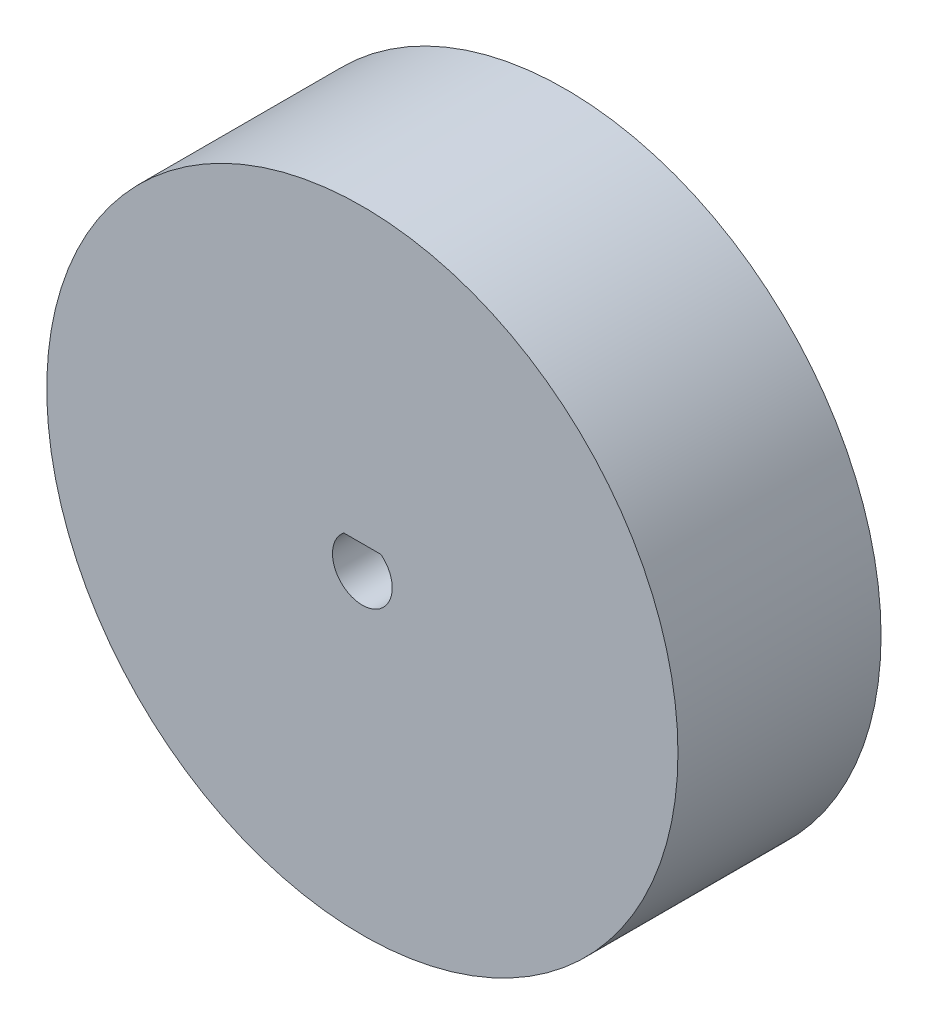
ISO-10303-21;
HEADER;
FILE_DESCRIPTION(('STEP AP214'),'2;1');
FILE_NAME('part.step','',(''),(''),'','','');
FILE_SCHEMA(('AUTOMOTIVE_DESIGN { 1 0 10303 214 1 1 1 1 }'));
ENDSEC;
DATA;
#1=APPLICATION_CONTEXT('core data for automotive mechanical design processes');
#2=APPLICATION_PROTOCOL_DEFINITION('international standard','automotive_design',2000,#1);
#3=PRODUCT_CONTEXT('',#1,'mechanical');
#4=PRODUCT('Part','Part','',(#3));
#5=PRODUCT_RELATED_PRODUCT_CATEGORY('part','',(#4));
#6=PRODUCT_DEFINITION_FORMATION('','',#4);
#7=PRODUCT_DEFINITION_CONTEXT('part definition',#1,'design');
#8=PRODUCT_DEFINITION('design','',#6,#7);
#9=PRODUCT_DEFINITION_SHAPE('','',#8);
#10=(LENGTH_UNIT() NAMED_UNIT(*) SI_UNIT(.MILLI.,.METRE.));
#11=(NAMED_UNIT(*) PLANE_ANGLE_UNIT() SI_UNIT($,.RADIAN.));
#12=(NAMED_UNIT(*) SI_UNIT($,.STERADIAN.) SOLID_ANGLE_UNIT());
#13=UNCERTAINTY_MEASURE_WITH_UNIT(LENGTH_MEASURE(1.E-05),#10,'distance_accuracy_value','');
#14=(GEOMETRIC_REPRESENTATION_CONTEXT(3) GLOBAL_UNCERTAINTY_ASSIGNED_CONTEXT((#13)) GLOBAL_UNIT_ASSIGNED_CONTEXT((#10,
#11,#12)) REPRESENTATION_CONTEXT('',''));
#15=CARTESIAN_POINT('',(0.,0.,0.));
#16=DIRECTION('',(0.,0.,1.));
#17=DIRECTION('',(1.,0.,0.));
#18=AXIS2_PLACEMENT_3D('',#15,#16,#17);
#19=CARTESIAN_POINT('',(0.,0.,13.899999886));
#20=DIRECTION('',(0.,0.,1.));
#21=DIRECTION('',(1.,0.,0.));
#22=AXIS2_PLACEMENT_3D('',#19,#20,#21);
#23=PLANE('',#22);
#24=CARTESIAN_POINT('',(0.,0.,13.899999886));
#25=DIRECTION('',(0.,0.,1.));
#26=DIRECTION('',(1.,0.,0.));
#27=AXIS2_PLACEMENT_3D('',#24,#25,#26);
#28=CIRCLE('',#27,21.59999998);
#29=CARTESIAN_POINT('',(21.59999998,0.,13.899999886));
#30=VERTEX_POINT('',#29);
#31=EDGE_CURVE('E11',#30,#30,#28,.T.);
#32=ORIENTED_EDGE('',*,*,#31,.T.);
#33=EDGE_LOOP('',(#32));
#34=FACE_BOUND('',#33,.T.);
#35=DIRECTION('',(-1.,0.,0.));
#36=VECTOR('',#35,1.);
#37=CARTESIAN_POINT('',(-1.27,1.60246625237476,13.899999886));
#38=LINE('',#37,#36);
#39=CARTESIAN_POINT('',(1.27,1.60246625237476,13.899999886));
#40=VERTEX_POINT('',#39);
#41=CARTESIAN_POINT('',(-1.27,1.60246625237476,13.899999886));
#42=VERTEX_POINT('',#41);
#43=EDGE_CURVE('E72',#40,#42,#38,.T.);
#44=ORIENTED_EDGE('',*,*,#43,.F.);
#45=CARTESIAN_POINT('',(0.,0.,13.899999886));
#46=DIRECTION('',(0.,0.,1.));
#47=DIRECTION('',(1.,0.,0.));
#48=AXIS2_PLACEMENT_3D('',#45,#46,#47);
#49=CIRCLE('',#48,2.0447);
#50=EDGE_CURVE('E63',#42,#40,#49,.T.);
#51=ORIENTED_EDGE('',*,*,#50,.F.);
#52=EDGE_LOOP('',(#44,#51));
#53=FACE_BOUND('',#52,.T.);
#54=ADVANCED_FACE('F31',(#34,#53),#23,.T.);
#55=CARTESIAN_POINT('',(0.,0.,0.));
#56=DIRECTION('',(0.,0.,1.));
#57=DIRECTION('',(1.,0.,0.));
#58=AXIS2_PLACEMENT_3D('',#55,#56,#57);
#59=PLANE('',#58);
#60=CARTESIAN_POINT('',(0.,0.,0.));
#61=DIRECTION('',(0.,0.,1.));
#62=DIRECTION('',(1.,0.,0.));
#63=AXIS2_PLACEMENT_3D('',#60,#61,#62);
#64=CIRCLE('',#63,21.59999998);
#65=CARTESIAN_POINT('',(21.59999998,0.,0.));
#66=VERTEX_POINT('',#65);
#67=EDGE_CURVE('E35',#66,#66,#64,.T.);
#68=ORIENTED_EDGE('',*,*,#67,.F.);
#69=EDGE_LOOP('',(#68));
#70=FACE_BOUND('',#69,.T.);
#71=CARTESIAN_POINT('',(0.,0.,0.));
#72=DIRECTION('',(0.,0.,1.));
#73=DIRECTION('',(1.,0.,0.));
#74=AXIS2_PLACEMENT_3D('',#71,#72,#73);
#75=CIRCLE('',#74,2.0447);
#76=CARTESIAN_POINT('',(-1.27,1.60246625237476,0.));
#77=VERTEX_POINT('',#76);
#78=CARTESIAN_POINT('',(1.27,1.60246625237476,0.));
#79=VERTEX_POINT('',#78);
#80=EDGE_CURVE('E53',#77,#79,#75,.T.);
#81=ORIENTED_EDGE('',*,*,#80,.T.);
#82=DIRECTION('',(-1.,0.,0.));
#83=VECTOR('',#82,1.);
#84=CARTESIAN_POINT('',(-1.27,1.60246625237476,0.));
#85=LINE('',#84,#83);
#86=EDGE_CURVE('E59',#79,#77,#85,.T.);
#87=ORIENTED_EDGE('',*,*,#86,.T.);
#88=EDGE_LOOP('',(#81,#87));
#89=FACE_BOUND('',#88,.T.);
#90=ADVANCED_FACE('F69',(#70,#89),#59,.F.);
#91=CARTESIAN_POINT('',(0.,0.,13.899999886));
#92=DIRECTION('',(0.,0.,-1.));
#93=DIRECTION('',(-1.,0.,0.));
#94=AXIS2_PLACEMENT_3D('',#91,#92,#93);
#95=CYLINDRICAL_SURFACE('',#94,21.59999998);
#96=ORIENTED_EDGE('',*,*,#31,.F.);
#97=EDGE_LOOP('',(#96));
#98=FACE_BOUND('',#97,.T.);
#99=ORIENTED_EDGE('',*,*,#67,.T.);
#100=EDGE_LOOP('',(#99));
#101=FACE_BOUND('',#100,.T.);
#102=ADVANCED_FACE('F33',(#98,#101),#95,.T.);
#103=CARTESIAN_POINT('',(0.,0.,13.899999886));
#104=DIRECTION('',(0.,0.,-1.));
#105=DIRECTION('',(-1.,0.,0.));
#106=AXIS2_PLACEMENT_3D('',#103,#104,#105);
#107=CYLINDRICAL_SURFACE('',#106,2.0447);
#108=ORIENTED_EDGE('',*,*,#80,.F.);
#109=DIRECTION('',(0.,0.,-1.));
#110=VECTOR('',#109,1.);
#111=CARTESIAN_POINT('',(-1.27,1.60246625237476,13.899999886));
#112=LINE('',#111,#110);
#113=EDGE_CURVE('E61',#42,#77,#112,.T.);
#114=ORIENTED_EDGE('',*,*,#113,.F.);
#115=ORIENTED_EDGE('',*,*,#50,.T.);
#116=DIRECTION('',(0.,0.,-1.));
#117=VECTOR('',#116,1.);
#118=CARTESIAN_POINT('',(1.27,1.60246625237476,13.899999886));
#119=LINE('',#118,#117);
#120=EDGE_CURVE('E46',#40,#79,#119,.T.);
#121=ORIENTED_EDGE('',*,*,#120,.T.);
#122=EDGE_LOOP('',(#108,#114,#115,#121));
#123=FACE_BOUND('',#122,.T.);
#124=ADVANCED_FACE('F65',(#123),#107,.F.);
#125=CARTESIAN_POINT('',(-1.27,1.60246625237476,13.899999886));
#126=DIRECTION('',(0.,-1.,0.));
#127=DIRECTION('',(0.,0.,-1.));
#128=AXIS2_PLACEMENT_3D('',#125,#126,#127);
#129=PLANE('',#128);
#130=ORIENTED_EDGE('',*,*,#86,.F.);
#131=ORIENTED_EDGE('',*,*,#120,.F.);
#132=ORIENTED_EDGE('',*,*,#43,.T.);
#133=ORIENTED_EDGE('',*,*,#113,.T.);
#134=EDGE_LOOP('',(#130,#131,#132,#133));
#135=FACE_BOUND('',#134,.T.);
#136=ADVANCED_FACE('F60',(#135),#129,.T.);
#137=CLOSED_SHELL('',(#54,#90,#102,#124,#136));
#138=MANIFOLD_SOLID_BREP('B2',#137);
#139=ADVANCED_BREP_SHAPE_REPRESENTATION('',(#18,#138),#14);
#140=SHAPE_DEFINITION_REPRESENTATION(#9,#139);
ENDSEC;
END-ISO-10303-21;
